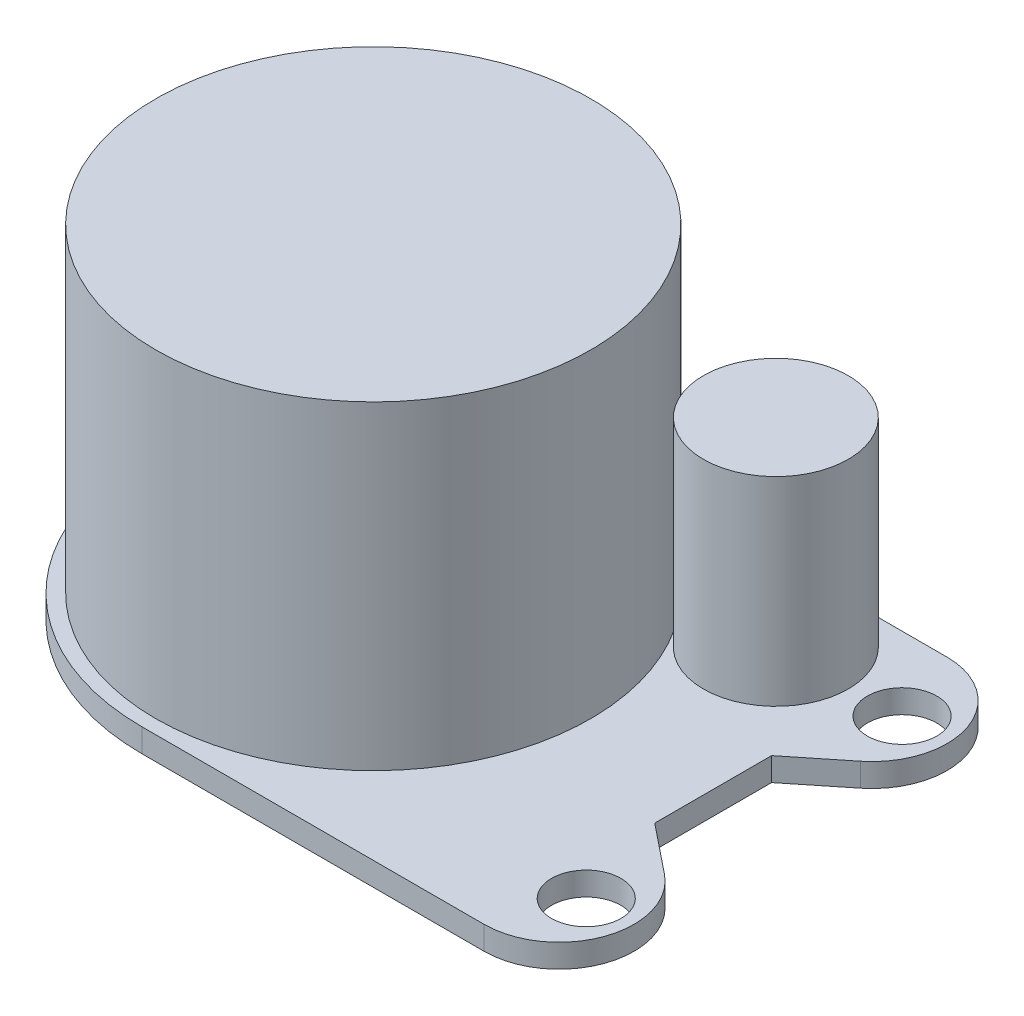
ISO-10303-21;
HEADER;
FILE_DESCRIPTION(('STEP AP214'),'2;1');
FILE_NAME('part.step','',(''),(''),'','','');
FILE_SCHEMA(('AUTOMOTIVE_DESIGN { 1 0 10303 214 1 1 1 1 }'));
ENDSEC;
DATA;
#1=APPLICATION_CONTEXT('core data for automotive mechanical design processes');
#2=APPLICATION_PROTOCOL_DEFINITION('international standard','automotive_design',2000,#1);
#3=PRODUCT_CONTEXT('',#1,'mechanical');
#4=PRODUCT('Part','Part','',(#3));
#5=PRODUCT_RELATED_PRODUCT_CATEGORY('part','',(#4));
#6=PRODUCT_DEFINITION_FORMATION('','',#4);
#7=PRODUCT_DEFINITION_CONTEXT('part definition',#1,'design');
#8=PRODUCT_DEFINITION('design','',#6,#7);
#9=PRODUCT_DEFINITION_SHAPE('','',#8);
#10=(LENGTH_UNIT() NAMED_UNIT(*) SI_UNIT(.MILLI.,.METRE.));
#11=(NAMED_UNIT(*) PLANE_ANGLE_UNIT() SI_UNIT($,.RADIAN.));
#12=(NAMED_UNIT(*) SI_UNIT($,.STERADIAN.) SOLID_ANGLE_UNIT());
#13=UNCERTAINTY_MEASURE_WITH_UNIT(LENGTH_MEASURE(1.E-05),#10,'distance_accuracy_value','');
#14=(GEOMETRIC_REPRESENTATION_CONTEXT(3) GLOBAL_UNCERTAINTY_ASSIGNED_CONTEXT((#13)) GLOBAL_UNIT_ASSIGNED_CONTEXT((#10,
#11,#12)) REPRESENTATION_CONTEXT('',''));
#15=CARTESIAN_POINT('',(0.,0.,0.));
#16=DIRECTION('',(0.,0.,1.));
#17=DIRECTION('',(1.,0.,0.));
#18=AXIS2_PLACEMENT_3D('',#15,#16,#17);
#19=CARTESIAN_POINT('',(-13.9330413083202,1.,-10.3038009427709));
#20=DIRECTION('',(0.,-1.,0.));
#21=DIRECTION('',(0.,0.,-1.));
#22=AXIS2_PLACEMENT_3D('',#19,#20,#21);
#23=CYLINDRICAL_SURFACE('',#22,3.20594155805063);
#24=CARTESIAN_POINT('',(-13.9330413083202,0.,-10.3038009427709));
#25=DIRECTION('',(0.,1.,0.));
#26=DIRECTION('',(0.,0.,1.));
#27=AXIS2_PLACEMENT_3D('',#24,#25,#26);
#28=CIRCLE('',#27,3.20594155805063);
#29=CARTESIAN_POINT('',(-11.9265456282424,0.,-7.80339370404656));
#30=VERTEX_POINT('',#29);
#31=CARTESIAN_POINT('',(-13.9330413083202,0.,-13.5097425008215));
#32=VERTEX_POINT('',#31);
#33=EDGE_CURVE('E138',#30,#32,#28,.T.);
#34=ORIENTED_EDGE('',*,*,#33,.T.);
#35=DIRECTION('',(0.,-1.,0.));
#36=VECTOR('',#35,1.);
#37=CARTESIAN_POINT('',(-13.9330413083202,1.,-13.5097425008215));
#38=LINE('',#37,#36);
#39=CARTESIAN_POINT('',(-13.9330413083202,1.,-13.5097425008215));
#40=VERTEX_POINT('',#39);
#41=EDGE_CURVE('E48',#40,#32,#38,.T.);
#42=ORIENTED_EDGE('',*,*,#41,.F.);
#43=CARTESIAN_POINT('',(-13.9330413083202,1.,-10.3038009427709));
#44=DIRECTION('',(0.,1.,0.));
#45=DIRECTION('',(0.,0.,1.));
#46=AXIS2_PLACEMENT_3D('',#43,#44,#45);
#47=CIRCLE('',#46,3.20594155805063);
#48=CARTESIAN_POINT('',(-11.9265456282424,1.,-7.80339370404656));
#49=VERTEX_POINT('',#48);
#50=EDGE_CURVE('E153',#49,#40,#47,.T.);
#51=ORIENTED_EDGE('',*,*,#50,.F.);
#52=DIRECTION('',(0.,-1.,0.));
#53=VECTOR('',#52,1.);
#54=CARTESIAN_POINT('',(-11.9265456282424,1.,-7.80339370404656));
#55=LINE('',#54,#53);
#56=EDGE_CURVE('E134',#49,#30,#55,.T.);
#57=ORIENTED_EDGE('',*,*,#56,.T.);
#58=EDGE_LOOP('',(#34,#42,#51,#57));
#59=FACE_BOUND('',#58,.T.);
#60=ADVANCED_FACE('F39',(#59),#23,.T.);
#61=CARTESIAN_POINT('',(-13.9330413083202,1.,-13.5097425008215));
#62=DIRECTION('',(0.,0.,1.));
#63=DIRECTION('',(1.,0.,0.));
#64=AXIS2_PLACEMENT_3D('',#61,#62,#63);
#65=PLANE('',#64);
#66=DIRECTION('',(-1.,0.,0.));
#67=VECTOR('',#66,1.);
#68=CARTESIAN_POINT('',(-13.9330413083202,0.,-13.5097425008215));
#69=LINE('',#68,#67);
#70=CARTESIAN_POINT('',(-28.5770997502696,0.,-13.5097425008215));
#71=VERTEX_POINT('',#70);
#72=EDGE_CURVE('E141',#32,#71,#69,.T.);
#73=ORIENTED_EDGE('',*,*,#72,.T.);
#74=DIRECTION('',(0.,-1.,0.));
#75=VECTOR('',#74,1.);
#76=CARTESIAN_POINT('',(-28.5770997502696,1.,-13.5097425008215));
#77=LINE('',#76,#75);
#78=CARTESIAN_POINT('',(-28.5770997502696,1.,-13.5097425008215));
#79=VERTEX_POINT('',#78);
#80=EDGE_CURVE('E163',#79,#71,#77,.T.);
#81=ORIENTED_EDGE('',*,*,#80,.F.);
#82=DIRECTION('',(-1.,0.,0.));
#83=VECTOR('',#82,1.);
#84=CARTESIAN_POINT('',(-13.9330413083202,1.,-13.5097425008215));
#85=LINE('',#84,#83);
#86=EDGE_CURVE('E101',#40,#79,#85,.T.);
#87=ORIENTED_EDGE('',*,*,#86,.F.);
#88=ORIENTED_EDGE('',*,*,#41,.T.);
#89=EDGE_LOOP('',(#73,#81,#87,#88));
#90=FACE_BOUND('',#89,.T.);
#91=ADVANCED_FACE('F222',(#90),#65,.F.);
#92=CARTESIAN_POINT('',(-28.5770997502696,1.,-3.60974250082154));
#93=DIRECTION('',(0.,-1.,0.));
#94=DIRECTION('',(0.,0.,-1.));
#95=AXIS2_PLACEMENT_3D('',#92,#93,#94);
#96=CYLINDRICAL_SURFACE('',#95,9.9);
#97=CARTESIAN_POINT('',(-28.5770997502696,0.,-3.60974250082154));
#98=DIRECTION('',(0.,1.,0.));
#99=DIRECTION('',(0.,0.,1.));
#100=AXIS2_PLACEMENT_3D('',#97,#98,#99);
#101=CIRCLE('',#100,9.9);
#102=CARTESIAN_POINT('',(-28.5770997502696,0.,6.29025749917846));
#103=VERTEX_POINT('',#102);
#104=EDGE_CURVE('E144',#71,#103,#101,.T.);
#105=ORIENTED_EDGE('',*,*,#104,.T.);
#106=DIRECTION('',(0.,-1.,0.));
#107=VECTOR('',#106,1.);
#108=CARTESIAN_POINT('',(-28.5770997502696,1.,6.29025749917846));
#109=LINE('',#108,#107);
#110=CARTESIAN_POINT('',(-28.5770997502696,1.,6.29025749917846));
#111=VERTEX_POINT('',#110);
#112=EDGE_CURVE('E160',#111,#103,#109,.T.);
#113=ORIENTED_EDGE('',*,*,#112,.F.);
#114=CARTESIAN_POINT('',(-28.5770997502696,1.,-3.60974250082154));
#115=DIRECTION('',(0.,1.,0.));
#116=DIRECTION('',(0.,0.,1.));
#117=AXIS2_PLACEMENT_3D('',#114,#115,#116);
#118=CIRCLE('',#117,9.9);
#119=EDGE_CURVE('E190',#79,#111,#118,.T.);
#120=ORIENTED_EDGE('',*,*,#119,.F.);
#121=ORIENTED_EDGE('',*,*,#80,.T.);
#122=EDGE_LOOP('',(#105,#113,#120,#121));
#123=FACE_BOUND('',#122,.T.);
#124=ADVANCED_FACE('F226',(#123),#96,.T.);
#125=CARTESIAN_POINT('',(-28.5770997502696,1.,6.29025749917846));
#126=DIRECTION('',(0.,0.,-1.));
#127=DIRECTION('',(-1.,0.,0.));
#128=AXIS2_PLACEMENT_3D('',#125,#126,#127);
#129=PLANE('',#128);
#130=DIRECTION('',(1.,0.,0.));
#131=VECTOR('',#130,1.);
#132=CARTESIAN_POINT('',(-28.5770997502696,0.,6.29025749917846));
#133=LINE('',#132,#131);
#134=CARTESIAN_POINT('',(-13.9330413083202,0.,6.29025749917846));
#135=VERTEX_POINT('',#134);
#136=EDGE_CURVE('E146',#103,#135,#133,.T.);
#137=ORIENTED_EDGE('',*,*,#136,.T.);
#138=DIRECTION('',(0.,-1.,0.));
#139=VECTOR('',#138,1.);
#140=CARTESIAN_POINT('',(-13.9330413083202,1.,6.29025749917846));
#141=LINE('',#140,#139);
#142=CARTESIAN_POINT('',(-13.9330413083202,1.,6.29025749917846));
#143=VERTEX_POINT('',#142);
#144=EDGE_CURVE('E157',#143,#135,#141,.T.);
#145=ORIENTED_EDGE('',*,*,#144,.F.);
#146=DIRECTION('',(1.,0.,0.));
#147=VECTOR('',#146,1.);
#148=CARTESIAN_POINT('',(-28.5770997502696,1.,6.29025749917846));
#149=LINE('',#148,#147);
#150=EDGE_CURVE('E192',#111,#143,#149,.T.);
#151=ORIENTED_EDGE('',*,*,#150,.F.);
#152=ORIENTED_EDGE('',*,*,#112,.T.);
#153=EDGE_LOOP('',(#137,#145,#151,#152));
#154=FACE_BOUND('',#153,.T.);
#155=ADVANCED_FACE('F198',(#154),#129,.F.);
#156=CARTESIAN_POINT('',(-13.9330413083202,1.,3.08431594112783));
#157=DIRECTION('',(0.,-1.,0.));
#158=DIRECTION('',(0.,0.,-1.));
#159=AXIS2_PLACEMENT_3D('',#156,#157,#158);
#160=CYLINDRICAL_SURFACE('',#159,3.20594155805063);
#161=CARTESIAN_POINT('',(-13.9330413083202,0.,3.08431594112783));
#162=DIRECTION('',(0.,1.,0.));
#163=DIRECTION('',(0.,0.,1.));
#164=AXIS2_PLACEMENT_3D('',#161,#162,#163);
#165=CIRCLE('',#164,3.20594155805063);
#166=CARTESIAN_POINT('',(-11.9265456282424,0.,0.58390870240348));
#167=VERTEX_POINT('',#166);
#168=EDGE_CURVE('E148',#135,#167,#165,.T.);
#169=ORIENTED_EDGE('',*,*,#168,.T.);
#170=DIRECTION('',(0.,-1.,0.));
#171=VECTOR('',#170,1.);
#172=CARTESIAN_POINT('',(-11.9265456282424,1.,0.58390870240348));
#173=LINE('',#172,#171);
#174=CARTESIAN_POINT('',(-11.9265456282424,1.,0.58390870240348));
#175=VERTEX_POINT('',#174);
#176=EDGE_CURVE('E129',#175,#167,#173,.T.);
#177=ORIENTED_EDGE('',*,*,#176,.F.);
#178=CARTESIAN_POINT('',(-13.9330413083202,1.,3.08431594112783));
#179=DIRECTION('',(0.,1.,0.));
#180=DIRECTION('',(0.,0.,1.));
#181=AXIS2_PLACEMENT_3D('',#178,#179,#180);
#182=CIRCLE('',#181,3.20594155805063);
#183=EDGE_CURVE('E120',#143,#175,#182,.T.);
#184=ORIENTED_EDGE('',*,*,#183,.F.);
#185=ORIENTED_EDGE('',*,*,#144,.T.);
#186=EDGE_LOOP('',(#169,#177,#184,#185));
#187=FACE_BOUND('',#186,.T.);
#188=ADVANCED_FACE('F202',(#187),#160,.T.);
#189=CARTESIAN_POINT('',(-14.0370997502696,1.,-1.10974250082154));
#190=DIRECTION('',(-0.625867828139038,0.,0.779929138896941));
#191=DIRECTION('',(0.779929138896941,0.,0.625867828139038));
#192=AXIS2_PLACEMENT_3D('',#189,#190,#191);
#193=PLANE('',#192);
#194=DIRECTION('',(-0.779929138896941,0.,-0.625867828139038));
#195=VECTOR('',#194,1.);
#196=CARTESIAN_POINT('',(-14.0370997502696,0.,-1.10974250082154));
#197=LINE('',#196,#195);
#198=CARTESIAN_POINT('',(-14.0370997502696,0.,-1.10974250082154));
#199=VERTEX_POINT('',#198);
#200=EDGE_CURVE('E128',#167,#199,#197,.T.);
#201=ORIENTED_EDGE('',*,*,#200,.T.);
#202=DIRECTION('',(0.,-1.,0.));
#203=VECTOR('',#202,1.);
#204=CARTESIAN_POINT('',(-14.0370997502696,1.,-1.10974250082154));
#205=LINE('',#204,#203);
#206=CARTESIAN_POINT('',(-14.0370997502696,1.,-1.10974250082154));
#207=VERTEX_POINT('',#206);
#208=EDGE_CURVE('E125',#207,#199,#205,.T.);
#209=ORIENTED_EDGE('',*,*,#208,.F.);
#210=DIRECTION('',(-0.779929138896941,0.,-0.625867828139038));
#211=VECTOR('',#210,1.);
#212=CARTESIAN_POINT('',(-14.0370997502696,1.,-1.10974250082154));
#213=LINE('',#212,#211);
#214=EDGE_CURVE('E114',#175,#207,#213,.T.);
#215=ORIENTED_EDGE('',*,*,#214,.F.);
#216=ORIENTED_EDGE('',*,*,#176,.T.);
#217=EDGE_LOOP('',(#201,#209,#215,#216));
#218=FACE_BOUND('',#217,.T.);
#219=ADVANCED_FACE('F126',(#218),#193,.F.);
#220=CARTESIAN_POINT('',(-14.0370997502696,1.,-6.10974250082154));
#221=DIRECTION('',(-1.,0.,0.));
#222=DIRECTION('',(0.,0.,1.));
#223=AXIS2_PLACEMENT_3D('',#220,#221,#222);
#224=PLANE('',#223);
#225=DIRECTION('',(0.,0.,-1.));
#226=VECTOR('',#225,1.);
#227=CARTESIAN_POINT('',(-14.0370997502696,0.,-6.10974250082154));
#228=LINE('',#227,#226);
#229=CARTESIAN_POINT('',(-14.0370997502696,0.,-6.10974250082154));
#230=VERTEX_POINT('',#229);
#231=EDGE_CURVE('E86',#199,#230,#228,.T.);
#232=ORIENTED_EDGE('',*,*,#231,.T.);
#233=DIRECTION('',(0.,-1.,0.));
#234=VECTOR('',#233,1.);
#235=CARTESIAN_POINT('',(-14.0370997502696,1.,-6.10974250082154));
#236=LINE('',#235,#234);
#237=CARTESIAN_POINT('',(-14.0370997502696,1.,-6.10974250082154));
#238=VERTEX_POINT('',#237);
#239=EDGE_CURVE('E130',#238,#230,#236,.T.);
#240=ORIENTED_EDGE('',*,*,#239,.F.);
#241=DIRECTION('',(0.,0.,-1.));
#242=VECTOR('',#241,1.);
#243=CARTESIAN_POINT('',(-14.0370997502696,1.,-6.10974250082154));
#244=LINE('',#243,#242);
#245=EDGE_CURVE('E118',#207,#238,#244,.T.);
#246=ORIENTED_EDGE('',*,*,#245,.F.);
#247=ORIENTED_EDGE('',*,*,#208,.T.);
#248=EDGE_LOOP('',(#232,#240,#246,#247));
#249=FACE_BOUND('',#248,.T.);
#250=ADVANCED_FACE('F132',(#249),#224,.F.);
#251=CARTESIAN_POINT('',(-14.0370997502696,1.,-6.10974250082154));
#252=DIRECTION('',(-0.625867828139038,0.,-0.779929138896941));
#253=DIRECTION('',(-0.77992913889694,0.,0.625867828139038));
#254=AXIS2_PLACEMENT_3D('',#251,#252,#253);
#255=PLANE('',#254);
#256=DIRECTION('',(0.779929138896941,0.,-0.625867828139038));
#257=VECTOR('',#256,1.);
#258=CARTESIAN_POINT('',(-14.0370997502696,0.,-6.10974250082154));
#259=LINE('',#258,#257);
#260=EDGE_CURVE('E92',#230,#30,#259,.T.);
#261=ORIENTED_EDGE('',*,*,#260,.T.);
#262=ORIENTED_EDGE('',*,*,#56,.F.);
#263=DIRECTION('',(0.779929138896941,0.,-0.625867828139038));
#264=VECTOR('',#263,1.);
#265=CARTESIAN_POINT('',(-14.0370997502696,1.,-6.10974250082154));
#266=LINE('',#265,#264);
#267=EDGE_CURVE('E57',#238,#49,#266,.T.);
#268=ORIENTED_EDGE('',*,*,#267,.F.);
#269=ORIENTED_EDGE('',*,*,#239,.T.);
#270=EDGE_LOOP('',(#261,#262,#268,#269));
#271=FACE_BOUND('',#270,.T.);
#272=ADVANCED_FACE('F210',(#271),#255,.F.);
#273=CARTESIAN_POINT('',(-13.9330413083202,1.,-10.3038009427709));
#274=DIRECTION('',(0.,1.,0.));
#275=DIRECTION('',(0.,0.,1.));
#276=AXIS2_PLACEMENT_3D('',#273,#274,#275);
#277=PLANE('',#276);
#278=CARTESIAN_POINT('',(-12.7120997502696,1.,-10.3647425008215));
#279=DIRECTION('',(0.,1.,0.));
#280=DIRECTION('',(0.,0.,1.));
#281=AXIS2_PLACEMENT_3D('',#278,#279,#280);
#282=CIRCLE('',#281,1.485);
#283=CARTESIAN_POINT('',(-12.7120997502696,1.,-8.87974250082154));
#284=VERTEX_POINT('',#283);
#285=EDGE_CURVE('E168',#284,#284,#282,.T.);
#286=ORIENTED_EDGE('',*,*,#285,.F.);
#287=EDGE_LOOP('',(#286));
#288=FACE_BOUND('',#287,.T.);
#289=CARTESIAN_POINT('',(-12.7120997502696,1.,3.14525749917846));
#290=DIRECTION('',(0.,1.,0.));
#291=DIRECTION('',(0.,0.,1.));
#292=AXIS2_PLACEMENT_3D('',#289,#290,#291);
#293=CIRCLE('',#292,1.485);
#294=CARTESIAN_POINT('',(-12.7120997502696,1.,4.63025749917846));
#295=VERTEX_POINT('',#294);
#296=EDGE_CURVE('E174',#295,#295,#293,.T.);
#297=ORIENTED_EDGE('',*,*,#296,.F.);
#298=EDGE_LOOP('',(#297));
#299=FACE_BOUND('',#298,.T.);
#300=CARTESIAN_POINT('',(-17.9626592312682,1.,-10.2157061906967));
#301=DIRECTION('',(0.,1.,0.));
#302=DIRECTION('',(0.,0.,1.));
#303=AXIS2_PLACEMENT_3D('',#300,#301,#302);
#304=CIRCLE('',#303,3.1);
#305=CARTESIAN_POINT('',(-17.9626592312682,1.,-7.11570619069674));
#306=VERTEX_POINT('',#305);
#307=EDGE_CURVE('E172',#306,#306,#304,.T.);
#308=ORIENTED_EDGE('',*,*,#307,.F.);
#309=EDGE_LOOP('',(#308));
#310=FACE_BOUND('',#309,.T.);
#311=CARTESIAN_POINT('',(-28.5770997502696,1.,-3.60974250082154));
#312=DIRECTION('',(0.,1.,0.));
#313=DIRECTION('',(0.,0.,1.));
#314=AXIS2_PLACEMENT_3D('',#311,#312,#313);
#315=CIRCLE('',#314,9.305);
#316=CARTESIAN_POINT('',(-28.5770997502696,1.,5.69525749917846));
#317=VERTEX_POINT('',#316);
#318=EDGE_CURVE('E11',#317,#317,#315,.T.);
#319=ORIENTED_EDGE('',*,*,#318,.F.);
#320=EDGE_LOOP('',(#319));
#321=FACE_BOUND('',#320,.T.);
#322=ORIENTED_EDGE('',*,*,#50,.T.);
#323=ORIENTED_EDGE('',*,*,#86,.T.);
#324=ORIENTED_EDGE('',*,*,#119,.T.);
#325=ORIENTED_EDGE('',*,*,#150,.T.);
#326=ORIENTED_EDGE('',*,*,#183,.T.);
#327=ORIENTED_EDGE('',*,*,#214,.T.);
#328=ORIENTED_EDGE('',*,*,#245,.T.);
#329=ORIENTED_EDGE('',*,*,#267,.T.);
#330=EDGE_LOOP('',(#322,#323,#324,#325,#326,#327,#328,#329));
#331=FACE_BOUND('',#330,.T.);
#332=ADVANCED_FACE('F116',(#288,#299,#310,#321,#331),#277,.T.);
#333=CARTESIAN_POINT('',(-13.9330413083202,0.,-10.3038009427709));
#334=DIRECTION('',(0.,1.,0.));
#335=DIRECTION('',(0.,0.,1.));
#336=AXIS2_PLACEMENT_3D('',#333,#334,#335);
#337=PLANE('',#336);
#338=CARTESIAN_POINT('',(-12.7120997502696,0.,-10.3647425008215));
#339=DIRECTION('',(0.,1.,0.));
#340=DIRECTION('',(0.,0.,1.));
#341=AXIS2_PLACEMENT_3D('',#338,#339,#340);
#342=CIRCLE('',#341,1.485);
#343=CARTESIAN_POINT('',(-12.7120997502696,0.,-8.87974250082154));
#344=VERTEX_POINT('',#343);
#345=EDGE_CURVE('E42',#344,#344,#342,.T.);
#346=ORIENTED_EDGE('',*,*,#345,.T.);
#347=EDGE_LOOP('',(#346));
#348=FACE_BOUND('',#347,.T.);
#349=CARTESIAN_POINT('',(-12.7120997502696,0.,3.14525749917846));
#350=DIRECTION('',(0.,1.,0.));
#351=DIRECTION('',(0.,0.,1.));
#352=AXIS2_PLACEMENT_3D('',#349,#350,#351);
#353=CIRCLE('',#352,1.485);
#354=CARTESIAN_POINT('',(-12.7120997502696,0.,4.63025749917846));
#355=VERTEX_POINT('',#354);
#356=EDGE_CURVE('E166',#355,#355,#353,.T.);
#357=ORIENTED_EDGE('',*,*,#356,.T.);
#358=EDGE_LOOP('',(#357));
#359=FACE_BOUND('',#358,.T.);
#360=ORIENTED_EDGE('',*,*,#33,.F.);
#361=ORIENTED_EDGE('',*,*,#260,.F.);
#362=ORIENTED_EDGE('',*,*,#231,.F.);
#363=ORIENTED_EDGE('',*,*,#200,.F.);
#364=ORIENTED_EDGE('',*,*,#168,.F.);
#365=ORIENTED_EDGE('',*,*,#136,.F.);
#366=ORIENTED_EDGE('',*,*,#104,.F.);
#367=ORIENTED_EDGE('',*,*,#72,.F.);
#368=EDGE_LOOP('',(#360,#361,#362,#363,#364,#365,#366,#367));
#369=FACE_BOUND('',#368,.T.);
#370=ADVANCED_FACE('F205',(#348,#359,#369),#337,.F.);
#371=CARTESIAN_POINT('',(-28.5770997502696,14.66,-3.60974250082154));
#372=DIRECTION('',(0.,-1.,0.));
#373=DIRECTION('',(0.,0.,-1.));
#374=AXIS2_PLACEMENT_3D('',#371,#372,#373);
#375=CYLINDRICAL_SURFACE('',#374,9.305);
#376=CARTESIAN_POINT('',(-28.5770997502696,14.66,-3.60974250082154));
#377=DIRECTION('',(0.,1.,0.));
#378=DIRECTION('',(0.,0.,1.));
#379=AXIS2_PLACEMENT_3D('',#376,#377,#378);
#380=CIRCLE('',#379,9.305);
#381=CARTESIAN_POINT('',(-28.5770997502696,14.66,5.69525749917846));
#382=VERTEX_POINT('',#381);
#383=EDGE_CURVE('E142',#382,#382,#380,.T.);
#384=ORIENTED_EDGE('',*,*,#383,.F.);
#385=EDGE_LOOP('',(#384));
#386=FACE_BOUND('',#385,.T.);
#387=ORIENTED_EDGE('',*,*,#318,.T.);
#388=EDGE_LOOP('',(#387));
#389=FACE_BOUND('',#388,.T.);
#390=ADVANCED_FACE('F258',(#386,#389),#375,.T.);
#391=CARTESIAN_POINT('',(-28.5770997502696,14.66,-3.60974250082154));
#392=DIRECTION('',(0.,1.,0.));
#393=DIRECTION('',(0.,0.,1.));
#394=AXIS2_PLACEMENT_3D('',#391,#392,#393);
#395=PLANE('',#394);
#396=ORIENTED_EDGE('',*,*,#383,.T.);
#397=EDGE_LOOP('',(#396));
#398=FACE_BOUND('',#397,.T.);
#399=ADVANCED_FACE('F264',(#398),#395,.T.);
#400=CARTESIAN_POINT('',(-17.9626592312682,9.51,-10.2157061906967));
#401=DIRECTION('',(0.,-1.,0.));
#402=DIRECTION('',(0.,0.,-1.));
#403=AXIS2_PLACEMENT_3D('',#400,#401,#402);
#404=CYLINDRICAL_SURFACE('',#403,3.1);
#405=CARTESIAN_POINT('',(-17.9626592312682,9.51,-10.2157061906967));
#406=DIRECTION('',(0.,1.,0.));
#407=DIRECTION('',(0.,0.,1.));
#408=AXIS2_PLACEMENT_3D('',#405,#406,#407);
#409=CIRCLE('',#408,3.1);
#410=CARTESIAN_POINT('',(-17.9626592312682,9.51,-7.11570619069674));
#411=VERTEX_POINT('',#410);
#412=EDGE_CURVE('E181',#411,#411,#409,.T.);
#413=ORIENTED_EDGE('',*,*,#412,.F.);
#414=EDGE_LOOP('',(#413));
#415=FACE_BOUND('',#414,.T.);
#416=ORIENTED_EDGE('',*,*,#307,.T.);
#417=EDGE_LOOP('',(#416));
#418=FACE_BOUND('',#417,.T.);
#419=ADVANCED_FACE('F277',(#415,#418),#404,.T.);
#420=CARTESIAN_POINT('',(-17.9626592312682,9.51,-10.2157061906967));
#421=DIRECTION('',(0.,1.,0.));
#422=DIRECTION('',(0.,0.,1.));
#423=AXIS2_PLACEMENT_3D('',#420,#421,#422);
#424=PLANE('',#423);
#425=ORIENTED_EDGE('',*,*,#412,.T.);
#426=EDGE_LOOP('',(#425));
#427=FACE_BOUND('',#426,.T.);
#428=ADVANCED_FACE('F288',(#427),#424,.T.);
#429=CARTESIAN_POINT('',(-12.7120997502696,-7.51,3.14525749917846));
#430=DIRECTION('',(0.,1.,0.));
#431=DIRECTION('',(0.,0.,1.));
#432=AXIS2_PLACEMENT_3D('',#429,#430,#431);
#433=CYLINDRICAL_SURFACE('',#432,1.485);
#434=ORIENTED_EDGE('',*,*,#296,.T.);
#435=EDGE_LOOP('',(#434));
#436=FACE_BOUND('',#435,.T.);
#437=ORIENTED_EDGE('',*,*,#356,.F.);
#438=EDGE_LOOP('',(#437));
#439=FACE_BOUND('',#438,.T.);
#440=ADVANCED_FACE('F299',(#436,#439),#433,.F.);
#441=CARTESIAN_POINT('',(-12.7120997502696,-7.51,-10.3647425008215));
#442=DIRECTION('',(0.,1.,0.));
#443=DIRECTION('',(0.,0.,1.));
#444=AXIS2_PLACEMENT_3D('',#441,#442,#443);
#445=CYLINDRICAL_SURFACE('',#444,1.485);
#446=ORIENTED_EDGE('',*,*,#285,.T.);
#447=EDGE_LOOP('',(#446));
#448=FACE_BOUND('',#447,.T.);
#449=ORIENTED_EDGE('',*,*,#345,.F.);
#450=EDGE_LOOP('',(#449));
#451=FACE_BOUND('',#450,.T.);
#452=ADVANCED_FACE('F324',(#448,#451),#445,.F.);
#453=CLOSED_SHELL('',(#60,#91,#124,#155,#188,#219,#250,#272,#332,#370,#390,#399,#419,#428,#440,#452));
#454=MANIFOLD_SOLID_BREP('B2',#453);
#455=ADVANCED_BREP_SHAPE_REPRESENTATION('',(#18,#454),#14);
#456=SHAPE_DEFINITION_REPRESENTATION(#9,#455);
ENDSEC;
END-ISO-10303-21;
